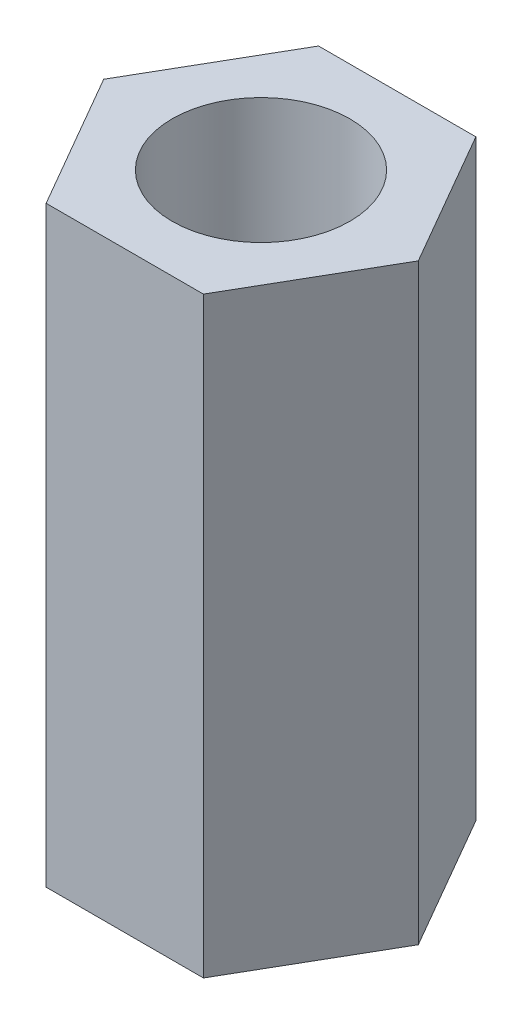
ISO-10303-21;
HEADER;
FILE_DESCRIPTION(('STEP AP214'),'2;1');
FILE_NAME('part.step','',(''),(''),'','','');
FILE_SCHEMA(('AUTOMOTIVE_DESIGN { 1 0 10303 214 1 1 1 1 }'));
ENDSEC;
DATA;
#1=APPLICATION_CONTEXT('core data for automotive mechanical design processes');
#2=APPLICATION_PROTOCOL_DEFINITION('international standard','automotive_design',2000,#1);
#3=PRODUCT_CONTEXT('',#1,'mechanical');
#4=PRODUCT('Part','Part','',(#3));
#5=PRODUCT_RELATED_PRODUCT_CATEGORY('part','',(#4));
#6=PRODUCT_DEFINITION_FORMATION('','',#4);
#7=PRODUCT_DEFINITION_CONTEXT('part definition',#1,'design');
#8=PRODUCT_DEFINITION('design','',#6,#7);
#9=PRODUCT_DEFINITION_SHAPE('','',#8);
#10=(LENGTH_UNIT() NAMED_UNIT(*) SI_UNIT(.MILLI.,.METRE.));
#11=(NAMED_UNIT(*) PLANE_ANGLE_UNIT() SI_UNIT($,.RADIAN.));
#12=(NAMED_UNIT(*) SI_UNIT($,.STERADIAN.) SOLID_ANGLE_UNIT());
#13=UNCERTAINTY_MEASURE_WITH_UNIT(LENGTH_MEASURE(1.E-05),#10,'distance_accuracy_value','');
#14=(GEOMETRIC_REPRESENTATION_CONTEXT(3) GLOBAL_UNCERTAINTY_ASSIGNED_CONTEXT((#13)) GLOBAL_UNIT_ASSIGNED_CONTEXT((#10,
#11,#12)) REPRESENTATION_CONTEXT('',''));
#15=CARTESIAN_POINT('',(0.,0.,0.));
#16=DIRECTION('',(0.,0.,1.));
#17=DIRECTION('',(1.,0.,0.));
#18=AXIS2_PLACEMENT_3D('',#15,#16,#17);
#19=CARTESIAN_POINT('',(0.,10.,0.));
#20=DIRECTION('',(0.,1.,0.));
#21=DIRECTION('',(0.,0.,1.));
#22=AXIS2_PLACEMENT_3D('',#19,#20,#21);
#23=PLANE('',#22);
#24=DIRECTION('',(1.,0.,0.));
#25=VECTOR('',#24,1.);
#26=CARTESIAN_POINT('',(-1.32790561913614,10.,2.3));
#27=LINE('',#26,#25);
#28=CARTESIAN_POINT('',(-1.32790561913614,10.,2.3));
#29=VERTEX_POINT('',#28);
#30=CARTESIAN_POINT('',(1.32790561913614,10.,2.3));
#31=VERTEX_POINT('',#30);
#32=EDGE_CURVE('E128',#29,#31,#27,.T.);
#33=ORIENTED_EDGE('',*,*,#32,.T.);
#34=DIRECTION('',(0.5,0.,-0.866025403784438));
#35=VECTOR('',#34,1.);
#36=CARTESIAN_POINT('',(1.32790561913614,10.,2.3));
#37=LINE('',#36,#35);
#38=CARTESIAN_POINT('',(2.65581123827228,10.,0.));
#39=VERTEX_POINT('',#38);
#40=EDGE_CURVE('E86',#31,#39,#37,.T.);
#41=ORIENTED_EDGE('',*,*,#40,.T.);
#42=DIRECTION('',(-0.5,0.,-0.866025403784438));
#43=VECTOR('',#42,1.);
#44=CARTESIAN_POINT('',(2.65581123827228,10.,0.));
#45=LINE('',#44,#43);
#46=CARTESIAN_POINT('',(1.32790561913614,10.,-2.3));
#47=VERTEX_POINT('',#46);
#48=EDGE_CURVE('E99',#39,#47,#45,.T.);
#49=ORIENTED_EDGE('',*,*,#48,.T.);
#50=DIRECTION('',(-1.,0.,0.));
#51=VECTOR('',#50,1.);
#52=CARTESIAN_POINT('',(1.32790561913614,10.,-2.3));
#53=LINE('',#52,#51);
#54=CARTESIAN_POINT('',(-1.32790561913614,10.,-2.3));
#55=VERTEX_POINT('',#54);
#56=EDGE_CURVE('E93',#47,#55,#53,.T.);
#57=ORIENTED_EDGE('',*,*,#56,.T.);
#58=DIRECTION('',(-0.5,0.,0.866025403784438));
#59=VECTOR('',#58,1.);
#60=CARTESIAN_POINT('',(-1.32790561913614,10.,-2.3));
#61=LINE('',#60,#59);
#62=CARTESIAN_POINT('',(-2.65581123827228,10.,0.));
#63=VERTEX_POINT('',#62);
#64=EDGE_CURVE('E97',#55,#63,#61,.T.);
#65=ORIENTED_EDGE('',*,*,#64,.T.);
#66=DIRECTION('',(0.5,0.,0.866025403784438));
#67=VECTOR('',#66,1.);
#68=CARTESIAN_POINT('',(-2.65581123827228,10.,0.));
#69=LINE('',#68,#67);
#70=EDGE_CURVE('E49',#63,#29,#69,.T.);
#71=ORIENTED_EDGE('',*,*,#70,.T.);
#72=EDGE_LOOP('',(#33,#41,#49,#57,#65,#71));
#73=FACE_BOUND('',#72,.T.);
#74=CARTESIAN_POINT('',(0.,10.,0.));
#75=DIRECTION('',(0.,1.,0.));
#76=DIRECTION('',(0.,0.,1.));
#77=AXIS2_PLACEMENT_3D('',#74,#75,#76);
#78=CIRCLE('',#77,1.5);
#79=CARTESIAN_POINT('',(0.,10.,1.5));
#80=VERTEX_POINT('',#79);
#81=EDGE_CURVE('E121',#80,#80,#78,.T.);
#82=ORIENTED_EDGE('',*,*,#81,.F.);
#83=EDGE_LOOP('',(#82));
#84=FACE_BOUND('',#83,.T.);
#85=ADVANCED_FACE('F32',(#73,#84),#23,.T.);
#86=CARTESIAN_POINT('',(0.,0.,0.));
#87=DIRECTION('',(0.,1.,0.));
#88=DIRECTION('',(0.,0.,1.));
#89=AXIS2_PLACEMENT_3D('',#86,#87,#88);
#90=PLANE('',#89);
#91=DIRECTION('',(1.,0.,0.));
#92=VECTOR('',#91,1.);
#93=CARTESIAN_POINT('',(-1.32790561913614,0.,2.3));
#94=LINE('',#93,#92);
#95=CARTESIAN_POINT('',(-1.32790561913614,0.,2.3));
#96=VERTEX_POINT('',#95);
#97=CARTESIAN_POINT('',(1.32790561913614,0.,2.3));
#98=VERTEX_POINT('',#97);
#99=EDGE_CURVE('E117',#96,#98,#94,.T.);
#100=ORIENTED_EDGE('',*,*,#99,.F.);
#101=DIRECTION('',(0.5,0.,0.866025403784438));
#102=VECTOR('',#101,1.);
#103=CARTESIAN_POINT('',(-2.65581123827228,0.,0.));
#104=LINE('',#103,#102);
#105=CARTESIAN_POINT('',(-2.65581123827228,0.,0.));
#106=VERTEX_POINT('',#105);
#107=EDGE_CURVE('E78',#106,#96,#104,.T.);
#108=ORIENTED_EDGE('',*,*,#107,.F.);
#109=DIRECTION('',(-0.5,0.,0.866025403784438));
#110=VECTOR('',#109,1.);
#111=CARTESIAN_POINT('',(-1.32790561913614,0.,-2.3));
#112=LINE('',#111,#110);
#113=CARTESIAN_POINT('',(-1.32790561913614,0.,-2.3));
#114=VERTEX_POINT('',#113);
#115=EDGE_CURVE('E72',#114,#106,#112,.T.);
#116=ORIENTED_EDGE('',*,*,#115,.F.);
#117=DIRECTION('',(-1.,0.,0.));
#118=VECTOR('',#117,1.);
#119=CARTESIAN_POINT('',(1.32790561913614,0.,-2.3));
#120=LINE('',#119,#118);
#121=CARTESIAN_POINT('',(1.32790561913614,0.,-2.3));
#122=VERTEX_POINT('',#121);
#123=EDGE_CURVE('E107',#122,#114,#120,.T.);
#124=ORIENTED_EDGE('',*,*,#123,.F.);
#125=DIRECTION('',(-0.5,0.,-0.866025403784438));
#126=VECTOR('',#125,1.);
#127=CARTESIAN_POINT('',(2.65581123827228,0.,0.));
#128=LINE('',#127,#126);
#129=CARTESIAN_POINT('',(2.65581123827228,0.,0.));
#130=VERTEX_POINT('',#129);
#131=EDGE_CURVE('E123',#130,#122,#128,.T.);
#132=ORIENTED_EDGE('',*,*,#131,.F.);
#133=DIRECTION('',(0.5,0.,-0.866025403784438));
#134=VECTOR('',#133,1.);
#135=CARTESIAN_POINT('',(1.32790561913614,0.,2.3));
#136=LINE('',#135,#134);
#137=EDGE_CURVE('E120',#98,#130,#136,.T.);
#138=ORIENTED_EDGE('',*,*,#137,.F.);
#139=EDGE_LOOP('',(#100,#108,#116,#124,#132,#138));
#140=FACE_BOUND('',#139,.T.);
#141=CARTESIAN_POINT('',(0.,0.,0.));
#142=DIRECTION('',(0.,1.,0.));
#143=DIRECTION('',(0.,0.,1.));
#144=AXIS2_PLACEMENT_3D('',#141,#142,#143);
#145=CIRCLE('',#144,1.5);
#146=CARTESIAN_POINT('',(0.,0.,1.5));
#147=VERTEX_POINT('',#146);
#148=EDGE_CURVE('E221',#147,#147,#145,.T.);
#149=ORIENTED_EDGE('',*,*,#148,.T.);
#150=EDGE_LOOP('',(#149));
#151=FACE_BOUND('',#150,.T.);
#152=ADVANCED_FACE('F137',(#140,#151),#90,.F.);
#153=CARTESIAN_POINT('',(-1.32790561913614,10.,2.3));
#154=DIRECTION('',(0.,0.,-1.));
#155=DIRECTION('',(-1.,0.,0.));
#156=AXIS2_PLACEMENT_3D('',#153,#154,#155);
#157=PLANE('',#156);
#158=ORIENTED_EDGE('',*,*,#99,.T.);
#159=DIRECTION('',(0.,-1.,0.));
#160=VECTOR('',#159,1.);
#161=CARTESIAN_POINT('',(1.32790561913614,10.,2.3));
#162=LINE('',#161,#160);
#163=EDGE_CURVE('E11',#31,#98,#162,.T.);
#164=ORIENTED_EDGE('',*,*,#163,.F.);
#165=ORIENTED_EDGE('',*,*,#32,.F.);
#166=DIRECTION('',(0.,-1.,0.));
#167=VECTOR('',#166,1.);
#168=CARTESIAN_POINT('',(-1.32790561913614,10.,2.3));
#169=LINE('',#168,#167);
#170=EDGE_CURVE('E113',#29,#96,#169,.T.);
#171=ORIENTED_EDGE('',*,*,#170,.T.);
#172=EDGE_LOOP('',(#158,#164,#165,#171));
#173=FACE_BOUND('',#172,.T.);
#174=ADVANCED_FACE('F34',(#173),#157,.F.);
#175=CARTESIAN_POINT('',(1.32790561913614,10.,2.3));
#176=DIRECTION('',(-0.866025403784439,0.,-0.5));
#177=DIRECTION('',(-0.5,0.,0.866025403784439));
#178=AXIS2_PLACEMENT_3D('',#175,#176,#177);
#179=PLANE('',#178);
#180=ORIENTED_EDGE('',*,*,#137,.T.);
#181=DIRECTION('',(0.,-1.,0.));
#182=VECTOR('',#181,1.);
#183=CARTESIAN_POINT('',(2.65581123827228,10.,0.));
#184=LINE('',#183,#182);
#185=EDGE_CURVE('E41',#39,#130,#184,.T.);
#186=ORIENTED_EDGE('',*,*,#185,.F.);
#187=ORIENTED_EDGE('',*,*,#40,.F.);
#188=ORIENTED_EDGE('',*,*,#163,.T.);
#189=EDGE_LOOP('',(#180,#186,#187,#188));
#190=FACE_BOUND('',#189,.T.);
#191=ADVANCED_FACE('F162',(#190),#179,.F.);
#192=CARTESIAN_POINT('',(2.65581123827228,10.,0.));
#193=DIRECTION('',(-0.866025403784438,0.,0.5));
#194=DIRECTION('',(0.5,0.,0.866025403784438));
#195=AXIS2_PLACEMENT_3D('',#192,#193,#194);
#196=PLANE('',#195);
#197=ORIENTED_EDGE('',*,*,#131,.T.);
#198=DIRECTION('',(0.,-1.,0.));
#199=VECTOR('',#198,1.);
#200=CARTESIAN_POINT('',(1.32790561913614,10.,-2.3));
#201=LINE('',#200,#199);
#202=EDGE_CURVE('E108',#47,#122,#201,.T.);
#203=ORIENTED_EDGE('',*,*,#202,.F.);
#204=ORIENTED_EDGE('',*,*,#48,.F.);
#205=ORIENTED_EDGE('',*,*,#185,.T.);
#206=EDGE_LOOP('',(#197,#203,#204,#205));
#207=FACE_BOUND('',#206,.T.);
#208=ADVANCED_FACE('F134',(#207),#196,.F.);
#209=CARTESIAN_POINT('',(1.32790561913614,10.,-2.3));
#210=DIRECTION('',(0.,0.,1.));
#211=DIRECTION('',(1.,0.,0.));
#212=AXIS2_PLACEMENT_3D('',#209,#210,#211);
#213=PLANE('',#212);
#214=ORIENTED_EDGE('',*,*,#123,.T.);
#215=DIRECTION('',(0.,-1.,0.));
#216=VECTOR('',#215,1.);
#217=CARTESIAN_POINT('',(-1.32790561913614,10.,-2.3));
#218=LINE('',#217,#216);
#219=EDGE_CURVE('E104',#55,#114,#218,.T.);
#220=ORIENTED_EDGE('',*,*,#219,.F.);
#221=ORIENTED_EDGE('',*,*,#56,.F.);
#222=ORIENTED_EDGE('',*,*,#202,.T.);
#223=EDGE_LOOP('',(#214,#220,#221,#222));
#224=FACE_BOUND('',#223,.T.);
#225=ADVANCED_FACE('F105',(#224),#213,.F.);
#226=CARTESIAN_POINT('',(-1.32790561913614,10.,-2.3));
#227=DIRECTION('',(0.866025403784438,0.,0.5));
#228=DIRECTION('',(0.5,0.,-0.866025403784439));
#229=AXIS2_PLACEMENT_3D('',#226,#227,#228);
#230=PLANE('',#229);
#231=ORIENTED_EDGE('',*,*,#115,.T.);
#232=DIRECTION('',(0.,-1.,0.));
#233=VECTOR('',#232,1.);
#234=CARTESIAN_POINT('',(-2.65581123827228,10.,0.));
#235=LINE('',#234,#233);
#236=EDGE_CURVE('E109',#63,#106,#235,.T.);
#237=ORIENTED_EDGE('',*,*,#236,.F.);
#238=ORIENTED_EDGE('',*,*,#64,.F.);
#239=ORIENTED_EDGE('',*,*,#219,.T.);
#240=EDGE_LOOP('',(#231,#237,#238,#239));
#241=FACE_BOUND('',#240,.T.);
#242=ADVANCED_FACE('F111',(#241),#230,.F.);
#243=CARTESIAN_POINT('',(-2.65581123827228,10.,0.));
#244=DIRECTION('',(0.866025403784438,0.,-0.5));
#245=DIRECTION('',(-0.5,0.,-0.866025403784438));
#246=AXIS2_PLACEMENT_3D('',#243,#244,#245);
#247=PLANE('',#246);
#248=ORIENTED_EDGE('',*,*,#107,.T.);
#249=ORIENTED_EDGE('',*,*,#170,.F.);
#250=ORIENTED_EDGE('',*,*,#70,.F.);
#251=ORIENTED_EDGE('',*,*,#236,.T.);
#252=EDGE_LOOP('',(#248,#249,#250,#251));
#253=FACE_BOUND('',#252,.T.);
#254=ADVANCED_FACE('F142',(#253),#247,.F.);
#255=CARTESIAN_POINT('',(0.,10.,0.));
#256=DIRECTION('',(0.,-1.,0.));
#257=DIRECTION('',(0.,0.,-1.));
#258=AXIS2_PLACEMENT_3D('',#255,#256,#257);
#259=CYLINDRICAL_SURFACE('',#258,1.5);
#260=ORIENTED_EDGE('',*,*,#81,.T.);
#261=EDGE_LOOP('',(#260));
#262=FACE_BOUND('',#261,.T.);
#263=ORIENTED_EDGE('',*,*,#148,.F.);
#264=EDGE_LOOP('',(#263));
#265=FACE_BOUND('',#264,.T.);
#266=ADVANCED_FACE('F144',(#262,#265),#259,.F.);
#267=CLOSED_SHELL('',(#85,#152,#174,#191,#208,#225,#242,#254,#266));
#268=MANIFOLD_SOLID_BREP('B2',#267);
#269=ADVANCED_BREP_SHAPE_REPRESENTATION('',(#18,#268),#14);
#270=SHAPE_DEFINITION_REPRESENTATION(#9,#269);
ENDSEC;
END-ISO-10303-21;
